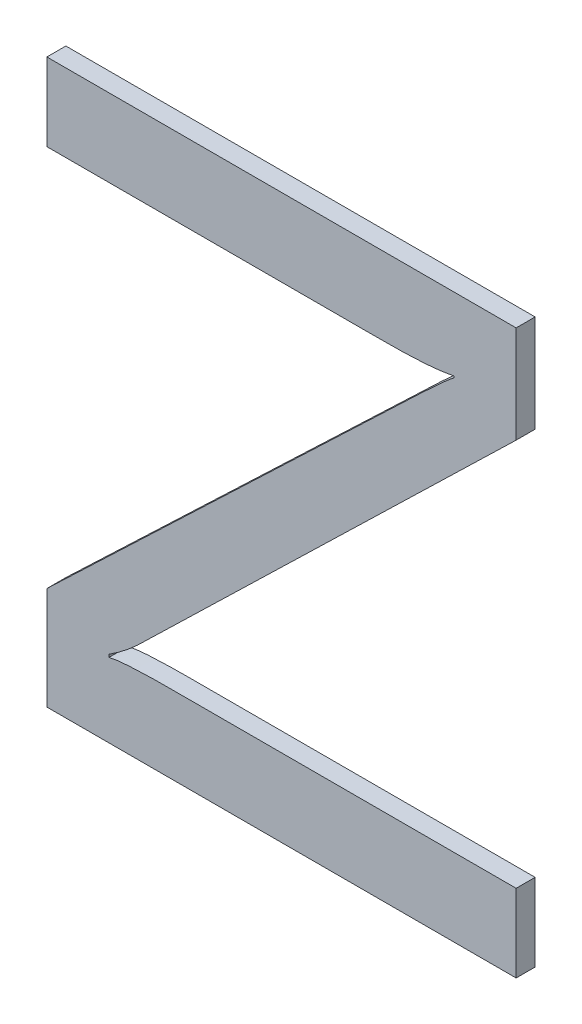
ISO-10303-21;
HEADER;
FILE_DESCRIPTION(('STEP AP214'),'2;1');
FILE_NAME('part.step','',(''),(''),'','','');
FILE_SCHEMA(('AUTOMOTIVE_DESIGN { 1 0 10303 214 1 1 1 1 }'));
ENDSEC;
DATA;
#1=APPLICATION_CONTEXT('core data for automotive mechanical design processes');
#2=APPLICATION_PROTOCOL_DEFINITION('international standard','automotive_design',2000,#1);
#3=PRODUCT_CONTEXT('',#1,'mechanical');
#4=PRODUCT('Part','Part','',(#3));
#5=PRODUCT_RELATED_PRODUCT_CATEGORY('part','',(#4));
#6=PRODUCT_DEFINITION_FORMATION('','',#4);
#7=PRODUCT_DEFINITION_CONTEXT('part definition',#1,'design');
#8=PRODUCT_DEFINITION('design','',#6,#7);
#9=PRODUCT_DEFINITION_SHAPE('','',#8);
#10=(LENGTH_UNIT() NAMED_UNIT(*) SI_UNIT(.MILLI.,.METRE.));
#11=(NAMED_UNIT(*) PLANE_ANGLE_UNIT() SI_UNIT($,.RADIAN.));
#12=(NAMED_UNIT(*) SI_UNIT($,.STERADIAN.) SOLID_ANGLE_UNIT());
#13=UNCERTAINTY_MEASURE_WITH_UNIT(LENGTH_MEASURE(1.E-05),#10,'distance_accuracy_value','');
#14=(GEOMETRIC_REPRESENTATION_CONTEXT(3) GLOBAL_UNCERTAINTY_ASSIGNED_CONTEXT((#13)) GLOBAL_UNIT_ASSIGNED_CONTEXT((#10,
#11,#12)) REPRESENTATION_CONTEXT('',''));
#15=CARTESIAN_POINT('',(0.,0.,0.));
#16=DIRECTION('',(0.,0.,1.));
#17=DIRECTION('',(1.,0.,0.));
#18=AXIS2_PLACEMENT_3D('',#15,#16,#17);
#19=CARTESIAN_POINT('',(-8.95983005625009,-22.7704584365744,333.160489148867));
#20=DIRECTION('',(0.,0.,1.));
#21=DIRECTION('',(1.,0.,0.));
#22=AXIS2_PLACEMENT_3D('',#19,#20,#21);
#23=PLANE('',#22);
#24=CARTESIAN_POINT('',(-12.8508212671876,-3.48993771323744,333.160489148867));
#25=CARTESIAN_POINT('',(-12.6975760748799,-3.45162650869395,333.160489148867));
#26=CARTESIAN_POINT('',(-12.3655443260348,-3.43247076612205,333.160489148867));
#27=CARTESIAN_POINT('',(-10.0413260748799,-3.43247076612205,333.160489148867));
#28=CARTESIAN_POINT('',(-8.22792463257218,-3.43247076612205,333.160489148867));
#29=CARTESIAN_POINT('',(-6.41452319026449,-3.43247076612205,333.160489148867));
#30=(BOUNDED_CURVE() B_SPLINE_CURVE(3,(#24,#25,#26,#27,#28,#29),.UNSPECIFIED.,.F.,
.F.) B_SPLINE_CURVE_WITH_KNOTS((4,2,4),(0.,0.219780052322297,1.),
.UNSPECIFIED.) CURVE() GEOMETRIC_REPRESENTATION_ITEM() RATIONAL_B_SPLINE_CURVE((1.,1.,1.,1.,1.,1.)) REPRESENTATION_ITEM(''));
#31=CARTESIAN_POINT('',(-12.8508212671876,-3.48993771323744,333.160489148867));
#32=VERTEX_POINT('',#31);
#33=CARTESIAN_POINT('',(-6.41452319026449,-3.43247076612205,333.160489148867));
#34=VERTEX_POINT('',#33);
#35=EDGE_CURVE('E155',#32,#34,#30,.T.);
#36=ORIENTED_EDGE('',*,*,#35,.T.);
#37=DIRECTION('',(0.,-1.,0.));
#38=VECTOR('',#37,1.);
#39=CARTESIAN_POINT('',(-6.41452319026449,-50.9500000001419,333.160489148867));
#40=LINE('',#39,#38);
#41=CARTESIAN_POINT('',(-6.41452319026449,-4.6608267607134,333.160489148867));
#42=VERTEX_POINT('',#41);
#43=EDGE_CURVE('E64',#34,#42,#40,.T.);
#44=ORIENTED_EDGE('',*,*,#43,.T.);
#45=DIRECTION('',(-1.,0.,0.));
#46=VECTOR('',#45,1.);
#47=CARTESIAN_POINT('',(2.66453525910038E-13,-4.6608267607134,333.160489148867));
#48=LINE('',#47,#46);
#49=CARTESIAN_POINT('',(-13.8325482804087,-4.6608267607134,333.160489148867));
#50=VERTEX_POINT('',#49);
#51=EDGE_CURVE('E251',#42,#50,#48,.T.);
#52=ORIENTED_EDGE('',*,*,#51,.T.);
#53=DIRECTION('',(0.,1.,0.));
#54=VECTOR('',#53,1.);
#55=CARTESIAN_POINT('',(-13.8325482804087,-50.9500000001419,333.160489148867));
#56=LINE('',#55,#54);
#57=CARTESIAN_POINT('',(-13.8325482804087,-3.03738550470378,333.160489148867));
#58=VERTEX_POINT('',#57);
#59=EDGE_CURVE('E216',#50,#58,#56,.T.);
#60=ORIENTED_EDGE('',*,*,#59,.T.);
#61=DIRECTION('',(0.724151841395312,0.689640566239965,0.));
#62=VECTOR('',#61,1.);
#63=CARTESIAN_POINT('',(-30.5065914345945,-18.9167852452411,333.160489148867));
#64=LINE('',#63,#62);
#65=CARTESIAN_POINT('',(-7.90387490300488,2.60874204938276,333.160489148867));
#66=VERTEX_POINT('',#65);
#67=EDGE_CURVE('E218',#58,#66,#64,.T.);
#68=ORIENTED_EDGE('',*,*,#67,.T.);
#69=CARTESIAN_POINT('',(-7.90387490300488,2.60874204938276,333.160489148867));
#70=CARTESIAN_POINT('',(-7.59738451838949,2.89607678495968,333.160489148867));
#71=CARTESIAN_POINT('',(-7.42817653463893,3.04692752113756,333.160489148867));
#72=CARTESIAN_POINT('',(-7.39625020348565,3.06129425791641,333.160489148867));
#73=(BOUNDED_CURVE() B_SPLINE_CURVE(3,(#69,#70,#71,#72),.UNSPECIFIED.,.F.,
.F.) B_SPLINE_CURVE_WITH_KNOTS((4,4),(0.,1.),
.UNSPECIFIED.) CURVE() GEOMETRIC_REPRESENTATION_ITEM() RATIONAL_B_SPLINE_CURVE((1.,1.,1.,1.)) REPRESENTATION_ITEM(''));
#74=CARTESIAN_POINT('',(-7.39625020348565,3.06129425791641,333.160489148867));
#75=VERTEX_POINT('',#74);
#76=EDGE_CURVE('E55',#66,#75,#73,.T.);
#77=ORIENTED_EDGE('',*,*,#76,.T.);
#78=DIRECTION('',(0.,1.,0.));
#79=VECTOR('',#78,1.);
#80=CARTESIAN_POINT('',(-7.39625020348565,-50.9500000001419,333.160489148867));
#81=LINE('',#80,#79);
#82=CARTESIAN_POINT('',(-7.39625020348565,3.09002773147412,333.160489148867));
#83=VERTEX_POINT('',#82);
#84=EDGE_CURVE('E296',#75,#83,#81,.T.);
#85=ORIENTED_EDGE('',*,*,#84,.T.);
#86=CARTESIAN_POINT('',(-7.39625020348565,3.09002773147411,333.160489148867));
#87=CARTESIAN_POINT('',(-7.64208078339006,3.03734950955145,333.160489148867));
#88=CARTESIAN_POINT('',(-8.01401988497603,3.01101067919045,333.160489148867));
#89=CARTESIAN_POINT('',(-10.2855606001203,3.01101067919045,333.160489148867));
#90=CARTESIAN_POINT('',(-12.0590544402645,3.01101067919045,333.160489148867));
#91=CARTESIAN_POINT('',(-13.8325482804087,3.01101067919045,333.160489148867));
#92=(BOUNDED_CURVE() B_SPLINE_CURVE(3,(#86,#87,#88,#89,#90,#91),.UNSPECIFIED.,.F.,
.F.) B_SPLINE_CURVE_WITH_KNOTS((4,2,4),(0.,0.21925509486999,1.),
.UNSPECIFIED.) CURVE() GEOMETRIC_REPRESENTATION_ITEM() RATIONAL_B_SPLINE_CURVE((1.,1.,1.,1.,1.,1.)) REPRESENTATION_ITEM(''));
#93=CARTESIAN_POINT('',(-13.8325482804087,3.01101067919045,333.160489148867));
#94=VERTEX_POINT('',#93);
#95=EDGE_CURVE('E274',#83,#94,#92,.T.);
#96=ORIENTED_EDGE('',*,*,#95,.T.);
#97=DIRECTION('',(0.,1.,0.));
#98=VECTOR('',#97,1.);
#99=CARTESIAN_POINT('',(-13.8325482804087,-50.9500000001419,333.160489148867));
#100=LINE('',#99,#98);
#101=CARTESIAN_POINT('',(-13.8325482804087,4.2393666737818,333.160489148867));
#102=VERTEX_POINT('',#101);
#103=EDGE_CURVE('E316',#94,#102,#100,.T.);
#104=ORIENTED_EDGE('',*,*,#103,.T.);
#105=DIRECTION('',(1.,0.,0.));
#106=VECTOR('',#105,1.);
#107=CARTESIAN_POINT('',(2.66453525910038E-13,4.2393666737818,333.160489148867));
#108=LINE('',#107,#106);
#109=CARTESIAN_POINT('',(-6.41452319026449,4.2393666737818,333.160489148867));
#110=VERTEX_POINT('',#109);
#111=EDGE_CURVE('E181',#102,#110,#108,.T.);
#112=ORIENTED_EDGE('',*,*,#111,.T.);
#113=DIRECTION('',(0.,-1.,0.));
#114=VECTOR('',#113,1.);
#115=CARTESIAN_POINT('',(-6.41452319026449,-50.9500000001419,333.160489148867));
#116=LINE('',#115,#114);
#117=CARTESIAN_POINT('',(-6.41452319026449,2.70212583844525,333.160489148867));
#118=VERTEX_POINT('',#117);
#119=EDGE_CURVE('E118',#110,#118,#116,.T.);
#120=ORIENTED_EDGE('',*,*,#119,.T.);
#121=DIRECTION('',(-0.718213324339423,-0.695822980894792,0.));
#122=VECTOR('',#121,1.);
#123=CARTESIAN_POINT('',(-29.9183315370501,-20.0689498740282,333.160489148867));
#124=LINE('',#123,#122);
#125=CARTESIAN_POINT('',(-12.4054524270433,-3.10203582020859,333.160489148867));
#126=VERTEX_POINT('',#125);
#127=EDGE_CURVE('E109',#118,#126,#124,.T.);
#128=ORIENTED_EDGE('',*,*,#127,.T.);
#129=CARTESIAN_POINT('',(-12.4054524270433,-3.10203582020859,333.160489148867));
#130=CARTESIAN_POINT('',(-12.6161641923327,-3.29598676672305,333.160489148867));
#131=CARTESIAN_POINT('',(-12.8508212671876,-3.4468375029009,333.160489148867));
#132=(BOUNDED_CURVE() B_SPLINE_CURVE(2,(#129,#130,#131),.UNSPECIFIED.,.F.,
.F.) B_SPLINE_CURVE_WITH_KNOTS((3,3),(0.,1.),
.UNSPECIFIED.) CURVE() GEOMETRIC_REPRESENTATION_ITEM() RATIONAL_B_SPLINE_CURVE((1.,1.,1.)) REPRESENTATION_ITEM(''));
#133=CARTESIAN_POINT('',(-12.8508212671876,-3.4468375029009,333.160489148867));
#134=VERTEX_POINT('',#133);
#135=EDGE_CURVE('E11',#126,#134,#132,.T.);
#136=ORIENTED_EDGE('',*,*,#135,.T.);
#137=DIRECTION('',(0.,-1.,0.));
#138=VECTOR('',#137,1.);
#139=CARTESIAN_POINT('',(-12.8508212671876,-50.9500000001419,333.160489148867));
#140=LINE('',#139,#138);
#141=EDGE_CURVE('E208',#134,#32,#140,.T.);
#142=ORIENTED_EDGE('',*,*,#141,.T.);
#143=EDGE_LOOP('',(#36,#44,#52,#60,#68,#77,#85,#96,#104,#112,#120,#128,#136,#142));
#144=FACE_BOUND('',#143,.T.);
#145=ADVANCED_FACE('F43',(#144),#23,.F.);
#146=CARTESIAN_POINT('',(-12.8508212671876,-3.4468375029009,332.960489148867));
#147=CARTESIAN_POINT('',(-12.6161641923327,-3.29598676672305,332.960489148867));
#148=CARTESIAN_POINT('',(-12.4054524270433,-3.10203582020859,332.960489148867));
#149=(BOUNDED_CURVE() B_SPLINE_CURVE(2,(#146,#147,#148),.UNSPECIFIED.,.F.,
.F.) B_SPLINE_CURVE_WITH_KNOTS((3,3),(0.,1.),
.UNSPECIFIED.) CURVE() GEOMETRIC_REPRESENTATION_ITEM() RATIONAL_B_SPLINE_CURVE((1.,1.,1.)) REPRESENTATION_ITEM(''));
#150=DIRECTION('',(0.,0.,1.));
#151=VECTOR('',#150,1.);
#152=SURFACE_OF_LINEAR_EXTRUSION('',#149,#151);
#153=ORIENTED_EDGE('',*,*,#135,.F.);
#154=CARTESIAN_POINT('',(-12.4054524270433,-3.10203582020859,333.160489148867));
#155=CARTESIAN_POINT('',(-12.4054524270433,-3.10203582020859,333.460489148867));
#156=(BOUNDED_CURVE() B_SPLINE_CURVE(1,(#154,#155),.UNSPECIFIED.,.F.,
.F.) B_SPLINE_CURVE_WITH_KNOTS((2,2),(0.,1.),
.UNSPECIFIED.) CURVE() GEOMETRIC_REPRESENTATION_ITEM() RATIONAL_B_SPLINE_CURVE((1.,1.)) REPRESENTATION_ITEM(''));
#157=CARTESIAN_POINT('',(-12.4054524270433,-3.10203582020859,333.460489148867));
#158=VERTEX_POINT('',#157);
#159=EDGE_CURVE('E177',#126,#158,#156,.T.);
#160=ORIENTED_EDGE('',*,*,#159,.T.);
#161=CARTESIAN_POINT('',(-12.8508212671876,-3.4468375029009,333.460489148867));
#162=CARTESIAN_POINT('',(-12.6943832172843,-3.346270345449,333.460489148867));
#163=CARTESIAN_POINT('',(-12.5459269372362,-3.23133645121823,333.460489148867));
#164=CARTESIAN_POINT('',(-12.4054524270433,-3.10203582020859,333.460489148867));
#165=(BOUNDED_CURVE() B_SPLINE_CURVE(3,(#161,#162,#163,#164),.UNSPECIFIED.,.F.,
.F.) B_SPLINE_CURVE_WITH_KNOTS((4,4),(0.,1.),
.UNSPECIFIED.) CURVE() GEOMETRIC_REPRESENTATION_ITEM() RATIONAL_B_SPLINE_CURVE((1.,1.,1.,1.)) REPRESENTATION_ITEM(''));
#166=CARTESIAN_POINT('',(-12.8508211005209,-3.44683759389286,333.460489148867));
#167=VERTEX_POINT('',#166);
#168=EDGE_CURVE('E343',#167,#158,#165,.T.);
#169=ORIENTED_EDGE('',*,*,#168,.F.);
#170=CARTESIAN_POINT('',(-12.8508212671876,-3.44683759389286,333.160489148867));
#171=CARTESIAN_POINT('',(-12.8508212671876,-3.44683759389286,333.260489148867));
#172=CARTESIAN_POINT('',(-12.8508212671876,-3.44683759389286,333.360489148867));
#173=CARTESIAN_POINT('',(-12.8508212671876,-3.44683759389286,333.460489148867));
#174=(BOUNDED_CURVE() B_SPLINE_CURVE(3,(#170,#171,#172,#173),.UNSPECIFIED.,.F.,
.F.) B_SPLINE_CURVE_WITH_KNOTS((4,4),(0.,1.),
.UNSPECIFIED.) CURVE() GEOMETRIC_REPRESENTATION_ITEM() RATIONAL_B_SPLINE_CURVE((1.,1.,1.,1.)) REPRESENTATION_ITEM(''));
#175=EDGE_CURVE('E203',#134,#167,#174,.T.);
#176=ORIENTED_EDGE('',*,*,#175,.F.);
#177=EDGE_LOOP('',(#153,#160,#169,#176));
#178=FACE_BOUND('',#177,.T.);
#179=ADVANCED_FACE('F428',(#178),#152,.T.);
#180=CARTESIAN_POINT('',(-7.90387490300488,2.60874204938276,332.960489148867));
#181=CARTESIAN_POINT('',(-7.59738451838949,2.89607678495968,332.960489148867));
#182=CARTESIAN_POINT('',(-7.42817653463893,3.04692752113756,332.960489148867));
#183=CARTESIAN_POINT('',(-7.39625020348565,3.06129425791641,332.960489148867));
#184=(BOUNDED_CURVE() B_SPLINE_CURVE(3,(#180,#181,#182,#183),.UNSPECIFIED.,.F.,
.F.) B_SPLINE_CURVE_WITH_KNOTS((4,4),(0.,1.),
.UNSPECIFIED.) CURVE() GEOMETRIC_REPRESENTATION_ITEM() RATIONAL_B_SPLINE_CURVE((1.,1.,1.,1.)) REPRESENTATION_ITEM(''));
#185=DIRECTION('',(0.,0.,1.));
#186=VECTOR('',#185,1.);
#187=SURFACE_OF_LINEAR_EXTRUSION('',#184,#186);
#188=ORIENTED_EDGE('',*,*,#76,.F.);
#189=CARTESIAN_POINT('',(-7.90387490300488,2.60874204938276,333.160489148867));
#190=CARTESIAN_POINT('',(-7.90387490300488,2.60874204938276,333.460489148867));
#191=(BOUNDED_CURVE() B_SPLINE_CURVE(1,(#189,#190),.UNSPECIFIED.,.F.,
.F.) B_SPLINE_CURVE_WITH_KNOTS((2,2),(0.,1.),
.UNSPECIFIED.) CURVE() GEOMETRIC_REPRESENTATION_ITEM() RATIONAL_B_SPLINE_CURVE((1.,1.)) REPRESENTATION_ITEM(''));
#192=CARTESIAN_POINT('',(-7.90387490300488,2.60874204938276,333.460489148867));
#193=VERTEX_POINT('',#192);
#194=EDGE_CURVE('E211',#66,#193,#191,.T.);
#195=ORIENTED_EDGE('',*,*,#194,.T.);
#196=CARTESIAN_POINT('',(-7.39625020348565,3.06129425791641,333.460489148867));
#197=CARTESIAN_POINT('',(-7.42817653463893,3.04692752113756,333.460489148867));
#198=CARTESIAN_POINT('',(-7.59738451838949,2.89607678495968,333.460489148867));
#199=CARTESIAN_POINT('',(-7.90387490300488,2.60874204938276,333.460489148867));
#200=(BOUNDED_CURVE() B_SPLINE_CURVE(3,(#196,#197,#198,#199),.UNSPECIFIED.,.F.,
.F.) B_SPLINE_CURVE_WITH_KNOTS((4,4),(0.,1.),
.UNSPECIFIED.) CURVE() GEOMETRIC_REPRESENTATION_ITEM() RATIONAL_B_SPLINE_CURVE((1.,1.,1.,1.)) REPRESENTATION_ITEM(''));
#201=CARTESIAN_POINT('',(-7.39625020348565,3.06129425791641,333.460489148867));
#202=VERTEX_POINT('',#201);
#203=EDGE_CURVE('E369',#202,#193,#200,.T.);
#204=ORIENTED_EDGE('',*,*,#203,.F.);
#205=CARTESIAN_POINT('',(-7.39625020348565,3.06129425791641,333.160489148867));
#206=CARTESIAN_POINT('',(-7.39625020348565,3.06129425791641,333.260489148867));
#207=CARTESIAN_POINT('',(-7.39625020348565,3.06129425791641,333.360489148867));
#208=CARTESIAN_POINT('',(-7.39625020348565,3.06129425791641,333.460489148867));
#209=(BOUNDED_CURVE() B_SPLINE_CURVE(3,(#205,#206,#207,#208),.UNSPECIFIED.,.F.,
.F.) B_SPLINE_CURVE_WITH_KNOTS((4,4),(0.,1.),
.UNSPECIFIED.) CURVE() GEOMETRIC_REPRESENTATION_ITEM() RATIONAL_B_SPLINE_CURVE((1.,1.,1.,1.)) REPRESENTATION_ITEM(''));
#210=EDGE_CURVE('E302',#75,#202,#209,.T.);
#211=ORIENTED_EDGE('',*,*,#210,.F.);
#212=EDGE_LOOP('',(#188,#195,#204,#211));
#213=FACE_BOUND('',#212,.T.);
#214=ADVANCED_FACE('F425',(#213),#187,.F.);
#215=CARTESIAN_POINT('',(-6.41452319026449,-4.6608267607134,332.960489148867));
#216=DIRECTION('',(1.,0.,0.));
#217=DIRECTION('',(0.,1.,0.));
#218=AXIS2_PLACEMENT_3D('',#215,#216,#217);
#219=PLANE('',#218);
#220=ORIENTED_EDGE('',*,*,#43,.F.);
#221=CARTESIAN_POINT('',(-6.41452319026449,-3.43247076612205,333.160489148867));
#222=CARTESIAN_POINT('',(-6.41452319026449,-3.43247076612205,333.260489148867));
#223=CARTESIAN_POINT('',(-6.41452319026449,-3.43247076612205,333.360489148867));
#224=CARTESIAN_POINT('',(-6.41452319026449,-3.43247076612205,333.460489148867));
#225=(BOUNDED_CURVE() B_SPLINE_CURVE(3,(#221,#222,#223,#224),.UNSPECIFIED.,.F.,
.F.) B_SPLINE_CURVE_WITH_KNOTS((4,4),(0.,1.),
.UNSPECIFIED.) CURVE() GEOMETRIC_REPRESENTATION_ITEM() RATIONAL_B_SPLINE_CURVE((1.,1.,1.,1.)) REPRESENTATION_ITEM(''));
#226=CARTESIAN_POINT('',(-6.41452319026449,-3.43247076612205,333.460489148867));
#227=VERTEX_POINT('',#226);
#228=EDGE_CURVE('E148',#34,#227,#225,.T.);
#229=ORIENTED_EDGE('',*,*,#228,.T.);
#230=CARTESIAN_POINT('',(-6.41452319026449,-4.6608267607134,333.460489148867));
#231=CARTESIAN_POINT('',(-6.41452319026449,-4.25137476251628,333.460489148867));
#232=CARTESIAN_POINT('',(-6.41452319026449,-3.84192276431916,333.460489148867));
#233=CARTESIAN_POINT('',(-6.41452319026449,-3.43247076612205,333.460489148867));
#234=(BOUNDED_CURVE() B_SPLINE_CURVE(3,(#230,#231,#232,#233),.UNSPECIFIED.,.F.,
.F.) B_SPLINE_CURVE_WITH_KNOTS((4,4),(0.,1.),
.UNSPECIFIED.) CURVE() GEOMETRIC_REPRESENTATION_ITEM() RATIONAL_B_SPLINE_CURVE((1.,1.,1.,1.)) REPRESENTATION_ITEM(''));
#235=CARTESIAN_POINT('',(-6.41452319026449,-4.6608267607134,333.460489148867));
#236=VERTEX_POINT('',#235);
#237=EDGE_CURVE('E152',#236,#227,#234,.T.);
#238=ORIENTED_EDGE('',*,*,#237,.F.);
#239=CARTESIAN_POINT('',(-6.41452319026449,-4.6608267607134,333.160489148867));
#240=CARTESIAN_POINT('',(-6.41452319026449,-4.6608267607134,333.260489148867));
#241=CARTESIAN_POINT('',(-6.41452319026449,-4.6608267607134,333.360489148867));
#242=CARTESIAN_POINT('',(-6.41452319026449,-4.6608267607134,333.460489148867));
#243=(BOUNDED_CURVE() B_SPLINE_CURVE(3,(#239,#240,#241,#242),.UNSPECIFIED.,.F.,
.F.) B_SPLINE_CURVE_WITH_KNOTS((4,4),(0.,1.),
.UNSPECIFIED.) CURVE() GEOMETRIC_REPRESENTATION_ITEM() RATIONAL_B_SPLINE_CURVE((1.,1.,1.,1.)) REPRESENTATION_ITEM(''));
#244=EDGE_CURVE('E217',#42,#236,#243,.T.);
#245=ORIENTED_EDGE('',*,*,#244,.F.);
#246=EDGE_LOOP('',(#220,#229,#238,#245));
#247=FACE_BOUND('',#246,.T.);
#248=ADVANCED_FACE('F150',(#247),#219,.T.);
#249=CARTESIAN_POINT('',(-12.8508212671876,-3.48993771323744,332.960489148867));
#250=CARTESIAN_POINT('',(-12.6975760748799,-3.45162650869395,332.960489148867));
#251=CARTESIAN_POINT('',(-12.3655443260348,-3.43247076612205,332.960489148867));
#252=CARTESIAN_POINT('',(-10.0413260748799,-3.43247076612205,332.960489148867));
#253=CARTESIAN_POINT('',(-8.22792463257218,-3.43247076612205,332.960489148867));
#254=CARTESIAN_POINT('',(-6.41452319026449,-3.43247076612205,332.960489148867));
#255=(BOUNDED_CURVE() B_SPLINE_CURVE(3,(#249,#250,#251,#252,#253,#254),.UNSPECIFIED.,.F.,
.F.) B_SPLINE_CURVE_WITH_KNOTS((4,2,4),(0.,0.219780052322297,1.),
.UNSPECIFIED.) CURVE() GEOMETRIC_REPRESENTATION_ITEM() RATIONAL_B_SPLINE_CURVE((1.,1.,1.,1.,1.,1.)) REPRESENTATION_ITEM(''));
#256=DIRECTION('',(0.,0.,1.));
#257=VECTOR('',#256,1.);
#258=SURFACE_OF_LINEAR_EXTRUSION('',#255,#257);
#259=ORIENTED_EDGE('',*,*,#35,.F.);
#260=CARTESIAN_POINT('',(-12.8508212671876,-3.48993771323744,333.160489148867));
#261=CARTESIAN_POINT('',(-12.8508212671876,-3.48993771323744,333.460489148867));
#262=(BOUNDED_CURVE() B_SPLINE_CURVE(1,(#260,#261),.UNSPECIFIED.,.F.,
.F.) B_SPLINE_CURVE_WITH_KNOTS((2,2),(0.,1.),
.UNSPECIFIED.) CURVE() GEOMETRIC_REPRESENTATION_ITEM() RATIONAL_B_SPLINE_CURVE((1.,1.)) REPRESENTATION_ITEM(''));
#263=CARTESIAN_POINT('',(-12.8508212671876,-3.48993771323744,333.460489148867));
#264=VERTEX_POINT('',#263);
#265=EDGE_CURVE('E161',#32,#264,#262,.T.);
#266=ORIENTED_EDGE('',*,*,#265,.T.);
#267=CARTESIAN_POINT('',(-6.41452319026449,-3.43247076612205,333.460489148867));
#268=CARTESIAN_POINT('',(-8.22792463257218,-3.43247076612205,333.460489148867));
#269=CARTESIAN_POINT('',(-10.0413260748799,-3.43247076612205,333.460489148867));
#270=CARTESIAN_POINT('',(-12.3655443260348,-3.43247076612205,333.460489148867));
#271=CARTESIAN_POINT('',(-12.6975760748799,-3.45162650869395,333.460489148867));
#272=CARTESIAN_POINT('',(-12.8508212671876,-3.48993771323744,333.460489148867));
#273=(BOUNDED_CURVE() B_SPLINE_CURVE(3,(#267,#268,#269,#270,#271,#272),.UNSPECIFIED.,.F.,
.F.) B_SPLINE_CURVE_WITH_KNOTS((4,2,4),(0.,0.780219947677703,1.),
.UNSPECIFIED.) CURVE() GEOMETRIC_REPRESENTATION_ITEM() RATIONAL_B_SPLINE_CURVE((1.,1.,1.,1.,1.,1.)) REPRESENTATION_ITEM(''));
#274=EDGE_CURVE('E158',#227,#264,#273,.T.);
#275=ORIENTED_EDGE('',*,*,#274,.F.);
#276=ORIENTED_EDGE('',*,*,#228,.F.);
#277=EDGE_LOOP('',(#259,#266,#275,#276));
#278=FACE_BOUND('',#277,.T.);
#279=ADVANCED_FACE('F159',(#278),#258,.F.);
#280=CARTESIAN_POINT('',(-12.8508212671876,-3.48993771323744,332.960489148867));
#281=DIRECTION('',(1.,0.,0.));
#282=DIRECTION('',(0.,1.,0.));
#283=AXIS2_PLACEMENT_3D('',#280,#281,#282);
#284=PLANE('',#283);
#285=ORIENTED_EDGE('',*,*,#141,.F.);
#286=ORIENTED_EDGE('',*,*,#175,.T.);
#287=CARTESIAN_POINT('',(-12.8508212671876,-3.48993771323744,333.460489148867));
#288=CARTESIAN_POINT('',(-12.8508212671876,-3.47557097645859,333.460489148867));
#289=CARTESIAN_POINT('',(-12.8508212671876,-3.46120423967974,333.460489148867));
#290=CARTESIAN_POINT('',(-12.8508212671876,-3.4468375029009,333.460489148867));
#291=(BOUNDED_CURVE() B_SPLINE_CURVE(3,(#287,#288,#289,#290),.UNSPECIFIED.,.F.,
.F.) B_SPLINE_CURVE_WITH_KNOTS((4,4),(0.,1.),
.UNSPECIFIED.) CURVE() GEOMETRIC_REPRESENTATION_ITEM() RATIONAL_B_SPLINE_CURVE((1.,1.,1.,1.)) REPRESENTATION_ITEM(''));
#292=EDGE_CURVE('E165',#264,#167,#291,.T.);
#293=ORIENTED_EDGE('',*,*,#292,.F.);
#294=ORIENTED_EDGE('',*,*,#265,.F.);
#295=EDGE_LOOP('',(#285,#286,#293,#294));
#296=FACE_BOUND('',#295,.T.);
#297=ADVANCED_FACE('F45',(#296),#284,.T.);
#298=CARTESIAN_POINT('',(-7.90387490300488,2.60874204938276,332.960489148867));
#299=DIRECTION('',(-0.689640566239965,0.724151841395312,0.));
#300=DIRECTION('',(0.,0.,1.));
#301=AXIS2_PLACEMENT_3D('',#298,#299,#300);
#302=PLANE('',#301);
#303=ORIENTED_EDGE('',*,*,#67,.F.);
#304=CARTESIAN_POINT('',(-13.8325482804087,-3.03738550470378,333.160489148867));
#305=CARTESIAN_POINT('',(-13.8325482804087,-3.03738550470378,333.260489148867));
#306=CARTESIAN_POINT('',(-13.8325482804087,-3.03738550470378,333.360489148867));
#307=CARTESIAN_POINT('',(-13.8325482804087,-3.03738550470378,333.460489148867));
#308=(BOUNDED_CURVE() B_SPLINE_CURVE(3,(#304,#305,#306,#307),.UNSPECIFIED.,.F.,
.F.) B_SPLINE_CURVE_WITH_KNOTS((4,4),(0.,1.),
.UNSPECIFIED.) CURVE() GEOMETRIC_REPRESENTATION_ITEM() RATIONAL_B_SPLINE_CURVE((1.,1.,1.,1.)) REPRESENTATION_ITEM(''));
#309=CARTESIAN_POINT('',(-13.8325482804087,-3.03738550470378,333.460489148867));
#310=VERTEX_POINT('',#309);
#311=EDGE_CURVE('E223',#58,#310,#308,.T.);
#312=ORIENTED_EDGE('',*,*,#311,.T.);
#313=CARTESIAN_POINT('',(-7.90387490300488,2.60874204938276,333.460489148867));
#314=CARTESIAN_POINT('',(-9.88009936213949,0.72669953135391,333.460489148867));
#315=CARTESIAN_POINT('',(-11.8563238212741,-1.15534298667494,333.460489148867));
#316=CARTESIAN_POINT('',(-13.8325482804087,-3.03738550470378,333.460489148867));
#317=(BOUNDED_CURVE() B_SPLINE_CURVE(3,(#313,#314,#315,#316),.UNSPECIFIED.,.F.,
.F.) B_SPLINE_CURVE_WITH_KNOTS((4,4),(0.,1.),
.UNSPECIFIED.) CURVE() GEOMETRIC_REPRESENTATION_ITEM() RATIONAL_B_SPLINE_CURVE((1.,1.,1.,1.)) REPRESENTATION_ITEM(''));
#318=EDGE_CURVE('E377',#193,#310,#317,.T.);
#319=ORIENTED_EDGE('',*,*,#318,.F.);
#320=ORIENTED_EDGE('',*,*,#194,.F.);
#321=EDGE_LOOP('',(#303,#312,#319,#320));
#322=FACE_BOUND('',#321,.T.);
#323=ADVANCED_FACE('F457',(#322),#302,.T.);
#324=CARTESIAN_POINT('',(-13.8325482804087,-3.03738550470378,332.960489148867));
#325=DIRECTION('',(-1.,0.,0.));
#326=DIRECTION('',(0.,0.,1.));
#327=AXIS2_PLACEMENT_3D('',#324,#325,#326);
#328=PLANE('',#327);
#329=ORIENTED_EDGE('',*,*,#59,.F.);
#330=CARTESIAN_POINT('',(-13.8325482804087,-4.6608267607134,333.160489148867));
#331=CARTESIAN_POINT('',(-13.8325482804087,-4.6608267607134,333.260489148867));
#332=CARTESIAN_POINT('',(-13.8325482804087,-4.6608267607134,333.360489148867));
#333=CARTESIAN_POINT('',(-13.8325482804087,-4.6608267607134,333.460489148867));
#334=(BOUNDED_CURVE() B_SPLINE_CURVE(3,(#330,#331,#332,#333),.UNSPECIFIED.,.F.,
.F.) B_SPLINE_CURVE_WITH_KNOTS((4,4),(0.,1.),
.UNSPECIFIED.) CURVE() GEOMETRIC_REPRESENTATION_ITEM() RATIONAL_B_SPLINE_CURVE((1.,1.,1.,1.)) REPRESENTATION_ITEM(''));
#335=CARTESIAN_POINT('',(-13.8325482804087,-4.6608267607134,333.460489148867));
#336=VERTEX_POINT('',#335);
#337=EDGE_CURVE('E212',#50,#336,#334,.T.);
#338=ORIENTED_EDGE('',*,*,#337,.T.);
#339=CARTESIAN_POINT('',(-13.8325482804087,-3.03738550470378,333.460489148867));
#340=CARTESIAN_POINT('',(-13.8325482804087,-3.57853259004032,333.460489148867));
#341=CARTESIAN_POINT('',(-13.8325482804087,-4.11967967537686,333.460489148867));
#342=CARTESIAN_POINT('',(-13.8325482804087,-4.6608267607134,333.460489148867));
#343=(BOUNDED_CURVE() B_SPLINE_CURVE(3,(#339,#340,#341,#342),.UNSPECIFIED.,.F.,
.F.) B_SPLINE_CURVE_WITH_KNOTS((4,4),(0.,1.),
.UNSPECIFIED.) CURVE() GEOMETRIC_REPRESENTATION_ITEM() RATIONAL_B_SPLINE_CURVE((1.,1.,1.,1.)) REPRESENTATION_ITEM(''));
#344=EDGE_CURVE('E47',#310,#336,#343,.T.);
#345=ORIENTED_EDGE('',*,*,#344,.F.);
#346=ORIENTED_EDGE('',*,*,#311,.F.);
#347=EDGE_LOOP('',(#329,#338,#345,#346));
#348=FACE_BOUND('',#347,.T.);
#349=ADVANCED_FACE('F455',(#348),#328,.T.);
#350=CARTESIAN_POINT('',(-13.8325482804087,-4.6608267607134,332.960489148867));
#351=DIRECTION('',(0.,-1.,0.));
#352=DIRECTION('',(0.,0.,-1.));
#353=AXIS2_PLACEMENT_3D('',#350,#351,#352);
#354=PLANE('',#353);
#355=ORIENTED_EDGE('',*,*,#51,.F.);
#356=ORIENTED_EDGE('',*,*,#244,.T.);
#357=CARTESIAN_POINT('',(-13.8325482804087,-4.6608267607134,333.460489148867));
#358=CARTESIAN_POINT('',(-11.3598732503606,-4.6608267607134,333.460489148867));
#359=CARTESIAN_POINT('',(-8.88719822031257,-4.6608267607134,333.460489148867));
#360=CARTESIAN_POINT('',(-6.41452319026449,-4.6608267607134,333.460489148867));
#361=(BOUNDED_CURVE() B_SPLINE_CURVE(3,(#357,#358,#359,#360),.UNSPECIFIED.,.F.,
.F.) B_SPLINE_CURVE_WITH_KNOTS((4,4),(0.,1.),
.UNSPECIFIED.) CURVE() GEOMETRIC_REPRESENTATION_ITEM() RATIONAL_B_SPLINE_CURVE((1.,1.,1.,1.)) REPRESENTATION_ITEM(''));
#362=EDGE_CURVE('E171',#336,#236,#361,.T.);
#363=ORIENTED_EDGE('',*,*,#362,.F.);
#364=ORIENTED_EDGE('',*,*,#337,.F.);
#365=EDGE_LOOP('',(#355,#356,#363,#364));
#366=FACE_BOUND('',#365,.T.);
#367=ADVANCED_FACE('F466',(#366),#354,.T.);
#368=CARTESIAN_POINT('',(-12.4054524270433,-3.10203582020859,332.960489148867));
#369=DIRECTION('',(0.695822980894792,-0.718213324339423,0.));
#370=DIRECTION('',(0.,0.,-1.));
#371=AXIS2_PLACEMENT_3D('',#368,#369,#370);
#372=PLANE('',#371);
#373=ORIENTED_EDGE('',*,*,#127,.F.);
#374=CARTESIAN_POINT('',(-6.41452319026449,2.70212583844525,333.160489148867));
#375=CARTESIAN_POINT('',(-6.41452319026449,2.70212583844525,333.260489148867));
#376=CARTESIAN_POINT('',(-6.41452319026449,2.70212583844525,333.360489148867));
#377=CARTESIAN_POINT('',(-6.41452319026449,2.70212583844525,333.460489148867));
#378=(BOUNDED_CURVE() B_SPLINE_CURVE(3,(#374,#375,#376,#377),.UNSPECIFIED.,.F.,
.F.) B_SPLINE_CURVE_WITH_KNOTS((4,4),(0.,1.),
.UNSPECIFIED.) CURVE() GEOMETRIC_REPRESENTATION_ITEM() RATIONAL_B_SPLINE_CURVE((1.,1.,1.,1.)) REPRESENTATION_ITEM(''));
#379=CARTESIAN_POINT('',(-6.41452319026449,2.70212583844525,333.460489148867));
#380=VERTEX_POINT('',#379);
#381=EDGE_CURVE('E256',#118,#380,#378,.T.);
#382=ORIENTED_EDGE('',*,*,#381,.T.);
#383=CARTESIAN_POINT('',(-12.4054524270433,-3.10203582020859,333.460489148867));
#384=CARTESIAN_POINT('',(-10.4084760147837,-1.16731526732397,333.460489148867));
#385=CARTESIAN_POINT('',(-8.41149960252411,0.767405285560641,333.460489148867));
#386=CARTESIAN_POINT('',(-6.41452319026449,2.70212583844525,333.460489148867));
#387=(BOUNDED_CURVE() B_SPLINE_CURVE(3,(#383,#384,#385,#386),.UNSPECIFIED.,.F.,
.F.) B_SPLINE_CURVE_WITH_KNOTS((4,4),(0.,1.),
.UNSPECIFIED.) CURVE() GEOMETRIC_REPRESENTATION_ITEM() RATIONAL_B_SPLINE_CURVE((1.,1.,1.,1.)) REPRESENTATION_ITEM(''));
#388=EDGE_CURVE('E242',#158,#380,#387,.T.);
#389=ORIENTED_EDGE('',*,*,#388,.F.);
#390=ORIENTED_EDGE('',*,*,#159,.F.);
#391=EDGE_LOOP('',(#373,#382,#389,#390));
#392=FACE_BOUND('',#391,.T.);
#393=ADVANCED_FACE('F464',(#392),#372,.T.);
#394=CARTESIAN_POINT('',(-6.41452319026449,2.70212583844525,332.960489148867));
#395=DIRECTION('',(1.,0.,0.));
#396=DIRECTION('',(0.,1.,0.));
#397=AXIS2_PLACEMENT_3D('',#394,#395,#396);
#398=PLANE('',#397);
#399=ORIENTED_EDGE('',*,*,#119,.F.);
#400=CARTESIAN_POINT('',(-6.41452319026449,4.2393666737818,333.160489148867));
#401=CARTESIAN_POINT('',(-6.41452319026449,4.2393666737818,333.260489148867));
#402=CARTESIAN_POINT('',(-6.41452319026449,4.2393666737818,333.360489148867));
#403=CARTESIAN_POINT('',(-6.41452319026449,4.2393666737818,333.460489148867));
#404=(BOUNDED_CURVE() B_SPLINE_CURVE(3,(#400,#401,#402,#403),.UNSPECIFIED.,.F.,
.F.) B_SPLINE_CURVE_WITH_KNOTS((4,4),(0.,1.),
.UNSPECIFIED.) CURVE() GEOMETRIC_REPRESENTATION_ITEM() RATIONAL_B_SPLINE_CURVE((1.,1.,1.,1.)) REPRESENTATION_ITEM(''));
#405=CARTESIAN_POINT('',(-6.41452319026449,4.2393666737818,333.460489148867));
#406=VERTEX_POINT('',#405);
#407=EDGE_CURVE('E186',#110,#406,#404,.T.);
#408=ORIENTED_EDGE('',*,*,#407,.T.);
#409=CARTESIAN_POINT('',(-6.41452319026449,2.70212583844525,333.460489148867));
#410=CARTESIAN_POINT('',(-6.41452319026449,3.21453945022411,333.460489148867));
#411=CARTESIAN_POINT('',(-6.41452319026449,3.72695306200295,333.460489148867));
#412=CARTESIAN_POINT('',(-6.41452319026449,4.2393666737818,333.460489148867));
#413=(BOUNDED_CURVE() B_SPLINE_CURVE(3,(#409,#410,#411,#412),.UNSPECIFIED.,.F.,
.F.) B_SPLINE_CURVE_WITH_KNOTS((4,4),(0.,1.),
.UNSPECIFIED.) CURVE() GEOMETRIC_REPRESENTATION_ITEM() RATIONAL_B_SPLINE_CURVE((1.,1.,1.,1.)) REPRESENTATION_ITEM(''));
#414=EDGE_CURVE('E238',#380,#406,#413,.T.);
#415=ORIENTED_EDGE('',*,*,#414,.F.);
#416=ORIENTED_EDGE('',*,*,#381,.F.);
#417=EDGE_LOOP('',(#399,#408,#415,#416));
#418=FACE_BOUND('',#417,.T.);
#419=ADVANCED_FACE('F430',(#418),#398,.T.);
#420=CARTESIAN_POINT('',(-6.41452319026449,4.2393666737818,332.960489148867));
#421=DIRECTION('',(0.,1.,0.));
#422=DIRECTION('',(1.,0.,0.));
#423=AXIS2_PLACEMENT_3D('',#420,#421,#422);
#424=PLANE('',#423);
#425=ORIENTED_EDGE('',*,*,#111,.F.);
#426=CARTESIAN_POINT('',(-13.8325482804087,4.2393666737818,333.160489148867));
#427=CARTESIAN_POINT('',(-13.8325482804087,4.2393666737818,333.260489148867));
#428=CARTESIAN_POINT('',(-13.8325482804087,4.2393666737818,333.360489148867));
#429=CARTESIAN_POINT('',(-13.8325482804087,4.2393666737818,333.460489148867));
#430=(BOUNDED_CURVE() B_SPLINE_CURVE(3,(#426,#427,#428,#429),.UNSPECIFIED.,.F.,
.F.) B_SPLINE_CURVE_WITH_KNOTS((4,4),(0.,1.),
.UNSPECIFIED.) CURVE() GEOMETRIC_REPRESENTATION_ITEM() RATIONAL_B_SPLINE_CURVE((1.,1.,1.,1.)) REPRESENTATION_ITEM(''));
#431=CARTESIAN_POINT('',(-13.8325482804087,4.2393666737818,333.460489148867));
#432=VERTEX_POINT('',#431);
#433=EDGE_CURVE('E187',#102,#432,#430,.T.);
#434=ORIENTED_EDGE('',*,*,#433,.T.);
#435=CARTESIAN_POINT('',(-6.41452319026449,4.2393666737818,333.460489148867));
#436=CARTESIAN_POINT('',(-8.88719822031257,4.2393666737818,333.460489148867));
#437=CARTESIAN_POINT('',(-11.3598732503606,4.2393666737818,333.460489148867));
#438=CARTESIAN_POINT('',(-13.8325482804087,4.2393666737818,333.460489148867));
#439=(BOUNDED_CURVE() B_SPLINE_CURVE(3,(#435,#436,#437,#438),.UNSPECIFIED.,.F.,
.F.) B_SPLINE_CURVE_WITH_KNOTS((4,4),(0.,1.),
.UNSPECIFIED.) CURVE() GEOMETRIC_REPRESENTATION_ITEM() RATIONAL_B_SPLINE_CURVE((1.,1.,1.,1.)) REPRESENTATION_ITEM(''));
#440=EDGE_CURVE('E229',#406,#432,#439,.T.);
#441=ORIENTED_EDGE('',*,*,#440,.F.);
#442=ORIENTED_EDGE('',*,*,#407,.F.);
#443=EDGE_LOOP('',(#425,#434,#441,#442));
#444=FACE_BOUND('',#443,.T.);
#445=ADVANCED_FACE('F460',(#444),#424,.T.);
#446=CARTESIAN_POINT('',(-13.8325482804087,4.2393666737818,332.960489148867));
#447=DIRECTION('',(-1.,0.,0.));
#448=DIRECTION('',(0.,0.,1.));
#449=AXIS2_PLACEMENT_3D('',#446,#447,#448);
#450=PLANE('',#449);
#451=ORIENTED_EDGE('',*,*,#103,.F.);
#452=CARTESIAN_POINT('',(-13.8325482804087,3.01101067919045,333.160489148867));
#453=CARTESIAN_POINT('',(-13.8325482804087,3.01101067919045,333.260489148867));
#454=CARTESIAN_POINT('',(-13.8325482804087,3.01101067919045,333.360489148867));
#455=CARTESIAN_POINT('',(-13.8325482804087,3.01101067919045,333.460489148867));
#456=(BOUNDED_CURVE() B_SPLINE_CURVE(3,(#452,#453,#454,#455),.UNSPECIFIED.,.F.,
.F.) B_SPLINE_CURVE_WITH_KNOTS((4,4),(0.,1.),
.UNSPECIFIED.) CURVE() GEOMETRIC_REPRESENTATION_ITEM() RATIONAL_B_SPLINE_CURVE((1.,1.,1.,1.)) REPRESENTATION_ITEM(''));
#457=CARTESIAN_POINT('',(-13.8325482804087,3.01101067919045,333.460489148867));
#458=VERTEX_POINT('',#457);
#459=EDGE_CURVE('E282',#94,#458,#456,.T.);
#460=ORIENTED_EDGE('',*,*,#459,.T.);
#461=CARTESIAN_POINT('',(-13.8325482804087,4.2393666737818,333.460489148867));
#462=CARTESIAN_POINT('',(-13.8325482804087,3.82991467558468,333.460489148867));
#463=CARTESIAN_POINT('',(-13.8325482804087,3.42046267738756,333.460489148867));
#464=CARTESIAN_POINT('',(-13.8325482804087,3.01101067919045,333.460489148867));
#465=(BOUNDED_CURVE() B_SPLINE_CURVE(3,(#461,#462,#463,#464),.UNSPECIFIED.,.F.,
.F.) B_SPLINE_CURVE_WITH_KNOTS((4,4),(0.,1.),
.UNSPECIFIED.) CURVE() GEOMETRIC_REPRESENTATION_ITEM() RATIONAL_B_SPLINE_CURVE((1.,1.,1.,1.)) REPRESENTATION_ITEM(''));
#466=EDGE_CURVE('E224',#432,#458,#465,.T.);
#467=ORIENTED_EDGE('',*,*,#466,.F.);
#468=ORIENTED_EDGE('',*,*,#433,.F.);
#469=EDGE_LOOP('',(#451,#460,#467,#468));
#470=FACE_BOUND('',#469,.T.);
#471=ADVANCED_FACE('F442',(#470),#450,.T.);
#472=CARTESIAN_POINT('',(-7.39625020348565,3.09002773147411,332.960489148867));
#473=CARTESIAN_POINT('',(-7.64208078339006,3.03734950955145,332.960489148867));
#474=CARTESIAN_POINT('',(-8.01401988497603,3.01101067919045,332.960489148867));
#475=CARTESIAN_POINT('',(-10.2855606001203,3.01101067919045,332.960489148867));
#476=CARTESIAN_POINT('',(-12.0590544402645,3.01101067919045,332.960489148867));
#477=CARTESIAN_POINT('',(-13.8325482804087,3.01101067919045,332.960489148867));
#478=(BOUNDED_CURVE() B_SPLINE_CURVE(3,(#472,#473,#474,#475,#476,#477),.UNSPECIFIED.,.F.,
.F.) B_SPLINE_CURVE_WITH_KNOTS((4,2,4),(0.,0.21925509486999,1.),
.UNSPECIFIED.) CURVE() GEOMETRIC_REPRESENTATION_ITEM() RATIONAL_B_SPLINE_CURVE((1.,1.,1.,1.,1.,1.)) REPRESENTATION_ITEM(''));
#479=DIRECTION('',(0.,0.,1.));
#480=VECTOR('',#479,1.);
#481=SURFACE_OF_LINEAR_EXTRUSION('',#478,#480);
#482=ORIENTED_EDGE('',*,*,#95,.F.);
#483=CARTESIAN_POINT('',(-7.39625020348565,3.09002773147411,333.160489148867));
#484=CARTESIAN_POINT('',(-7.39625020348565,3.09002773147411,333.460489148867));
#485=(BOUNDED_CURVE() B_SPLINE_CURVE(1,(#483,#484),.UNSPECIFIED.,.F.,
.F.) B_SPLINE_CURVE_WITH_KNOTS((2,2),(0.,1.),
.UNSPECIFIED.) CURVE() GEOMETRIC_REPRESENTATION_ITEM() RATIONAL_B_SPLINE_CURVE((1.,1.)) REPRESENTATION_ITEM(''));
#486=CARTESIAN_POINT('',(-7.39625020348565,3.09002773147411,333.460489148867));
#487=VERTEX_POINT('',#486);
#488=EDGE_CURVE('E283',#83,#487,#485,.T.);
#489=ORIENTED_EDGE('',*,*,#488,.T.);
#490=CARTESIAN_POINT('',(-13.8325482804087,3.01101067919045,333.460489148867));
#491=CARTESIAN_POINT('',(-12.0590544402645,3.01101067919045,333.460489148867));
#492=CARTESIAN_POINT('',(-10.2855606001203,3.01101067919045,333.460489148867));
#493=CARTESIAN_POINT('',(-8.01401988497603,3.01101067919045,333.460489148867));
#494=CARTESIAN_POINT('',(-7.64208078339006,3.03734950955145,333.460489148867));
#495=CARTESIAN_POINT('',(-7.39625020348565,3.09002773147411,333.460489148867));
#496=(BOUNDED_CURVE() B_SPLINE_CURVE(3,(#490,#491,#492,#493,#494,#495),.UNSPECIFIED.,.F.,
.F.) B_SPLINE_CURVE_WITH_KNOTS((4,2,4),(0.,0.78074490513001,1.),
.UNSPECIFIED.) CURVE() GEOMETRIC_REPRESENTATION_ITEM() RATIONAL_B_SPLINE_CURVE((1.,1.,1.,1.,1.,1.)) REPRESENTATION_ITEM(''));
#497=EDGE_CURVE('E228',#458,#487,#496,.T.);
#498=ORIENTED_EDGE('',*,*,#497,.F.);
#499=ORIENTED_EDGE('',*,*,#459,.F.);
#500=EDGE_LOOP('',(#482,#489,#498,#499));
#501=FACE_BOUND('',#500,.T.);
#502=ADVANCED_FACE('F434',(#501),#481,.F.);
#503=CARTESIAN_POINT('',(-7.39625020348565,3.09002773147411,332.960489148867));
#504=DIRECTION('',(-1.,0.,0.));
#505=DIRECTION('',(0.,0.,1.));
#506=AXIS2_PLACEMENT_3D('',#503,#504,#505);
#507=PLANE('',#506);
#508=ORIENTED_EDGE('',*,*,#84,.F.);
#509=ORIENTED_EDGE('',*,*,#210,.T.);
#510=CARTESIAN_POINT('',(-7.39625020348565,3.09002773147411,333.460489148867));
#511=CARTESIAN_POINT('',(-7.39625020348565,3.08044990695487,333.460489148867));
#512=CARTESIAN_POINT('',(-7.39625020348565,3.07087208243564,333.460489148867));
#513=CARTESIAN_POINT('',(-7.39625020348565,3.06129425791641,333.460489148867));
#514=(BOUNDED_CURVE() B_SPLINE_CURVE(3,(#510,#511,#512,#513),.UNSPECIFIED.,.F.,
.F.) B_SPLINE_CURVE_WITH_KNOTS((4,4),(0.,1.),
.UNSPECIFIED.) CURVE() GEOMETRIC_REPRESENTATION_ITEM() RATIONAL_B_SPLINE_CURVE((1.,1.,1.,1.)) REPRESENTATION_ITEM(''));
#515=EDGE_CURVE('E236',#487,#202,#514,.T.);
#516=ORIENTED_EDGE('',*,*,#515,.F.);
#517=ORIENTED_EDGE('',*,*,#488,.F.);
#518=EDGE_LOOP('',(#508,#509,#516,#517));
#519=FACE_BOUND('',#518,.T.);
#520=ADVANCED_FACE('F432',(#519),#507,.T.);
#521=CARTESIAN_POINT('',(-9.90085056699695,-3.43247076612205,333.460489148867));
#522=DIRECTION('',(0.,0.,-1.));
#523=DIRECTION('',(0.,-1.,0.));
#524=AXIS2_PLACEMENT_3D('',#521,#522,#523);
#525=PLANE('',#524);
#526=ORIENTED_EDGE('',*,*,#237,.T.);
#527=ORIENTED_EDGE('',*,*,#274,.T.);
#528=ORIENTED_EDGE('',*,*,#292,.T.);
#529=ORIENTED_EDGE('',*,*,#168,.T.);
#530=ORIENTED_EDGE('',*,*,#388,.T.);
#531=ORIENTED_EDGE('',*,*,#414,.T.);
#532=ORIENTED_EDGE('',*,*,#440,.T.);
#533=ORIENTED_EDGE('',*,*,#466,.T.);
#534=ORIENTED_EDGE('',*,*,#497,.T.);
#535=ORIENTED_EDGE('',*,*,#515,.T.);
#536=ORIENTED_EDGE('',*,*,#203,.T.);
#537=ORIENTED_EDGE('',*,*,#318,.T.);
#538=ORIENTED_EDGE('',*,*,#344,.T.);
#539=ORIENTED_EDGE('',*,*,#362,.T.);
#540=EDGE_LOOP('',(#526,#527,#528,#529,#530,#531,#532,#533,#534,#535,#536,#537,#538,#539));
#541=FACE_BOUND('',#540,.T.);
#542=ADVANCED_FACE('F168',(#541),#525,.F.);
#543=CLOSED_SHELL('',(#145,#179,#214,#248,#279,#297,#323,#349,#367,#393,#419,#445,#471,#502,
#520,#542));
#544=MANIFOLD_SOLID_BREP('B2',#543);
#545=ADVANCED_BREP_SHAPE_REPRESENTATION('',(#18,#544),#14);
#546=SHAPE_DEFINITION_REPRESENTATION(#9,#545);
ENDSEC;
END-ISO-10303-21;
